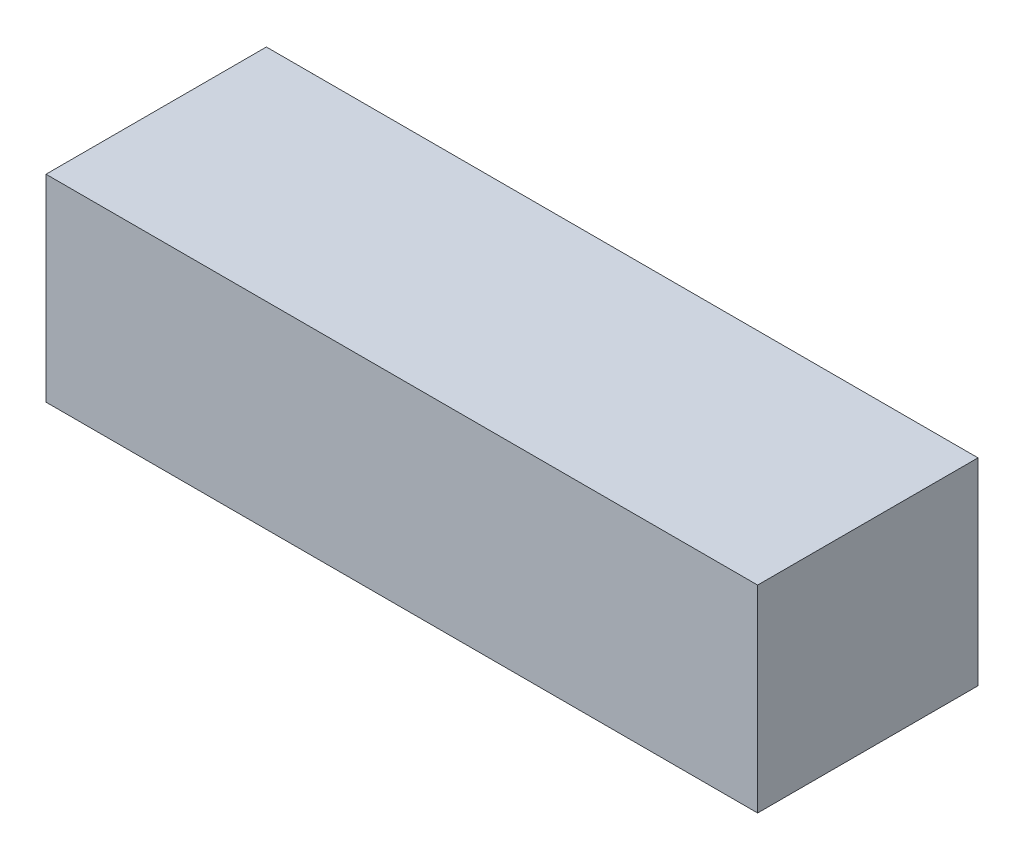
ISO-10303-21;
HEADER;
FILE_DESCRIPTION(('STEP AP214'),'2;1');
FILE_NAME('part.step','',(''),(''),'','','');
FILE_SCHEMA(('AUTOMOTIVE_DESIGN { 1 0 10303 214 1 1 1 1 }'));
ENDSEC;
DATA;
#1=APPLICATION_CONTEXT('core data for automotive mechanical design processes');
#2=APPLICATION_PROTOCOL_DEFINITION('international standard','automotive_design',2000,#1);
#3=PRODUCT_CONTEXT('',#1,'mechanical');
#4=PRODUCT('Part','Part','',(#3));
#5=PRODUCT_RELATED_PRODUCT_CATEGORY('part','',(#4));
#6=PRODUCT_DEFINITION_FORMATION('','',#4);
#7=PRODUCT_DEFINITION_CONTEXT('part definition',#1,'design');
#8=PRODUCT_DEFINITION('design','',#6,#7);
#9=PRODUCT_DEFINITION_SHAPE('','',#8);
#10=(LENGTH_UNIT() NAMED_UNIT(*) SI_UNIT(.MILLI.,.METRE.));
#11=(NAMED_UNIT(*) PLANE_ANGLE_UNIT() SI_UNIT($,.RADIAN.));
#12=(NAMED_UNIT(*) SI_UNIT($,.STERADIAN.) SOLID_ANGLE_UNIT());
#13=UNCERTAINTY_MEASURE_WITH_UNIT(LENGTH_MEASURE(1.E-05),#10,'distance_accuracy_value','');
#14=(GEOMETRIC_REPRESENTATION_CONTEXT(3) GLOBAL_UNCERTAINTY_ASSIGNED_CONTEXT((#13)) GLOBAL_UNIT_ASSIGNED_CONTEXT((#10,
#11,#12)) REPRESENTATION_CONTEXT('',''));
#15=CARTESIAN_POINT('',(0.,0.,0.));
#16=DIRECTION('',(0.,0.,1.));
#17=DIRECTION('',(1.,0.,0.));
#18=AXIS2_PLACEMENT_3D('',#15,#16,#17);
#19=CARTESIAN_POINT('',(77.5,43.,-24.));
#20=DIRECTION('',(-1.,0.,0.));
#21=DIRECTION('',(0.,0.,1.));
#22=AXIS2_PLACEMENT_3D('',#19,#20,#21);
#23=PLANE('',#22);
#24=DIRECTION('',(0.,0.,-1.));
#25=VECTOR('',#24,1.);
#26=CARTESIAN_POINT('',(77.5,0.,-24.));
#27=LINE('',#26,#25);
#28=CARTESIAN_POINT('',(77.5,0.,24.));
#29=VERTEX_POINT('',#28);
#30=CARTESIAN_POINT('',(77.5,0.,-24.));
#31=VERTEX_POINT('',#30);
#32=EDGE_CURVE('E99',#29,#31,#27,.T.);
#33=ORIENTED_EDGE('',*,*,#32,.T.);
#34=DIRECTION('',(0.,-1.,0.));
#35=VECTOR('',#34,1.);
#36=CARTESIAN_POINT('',(77.5,43.,-24.));
#37=LINE('',#36,#35);
#38=CARTESIAN_POINT('',(77.5,43.,-24.));
#39=VERTEX_POINT('',#38);
#40=EDGE_CURVE('E11',#39,#31,#37,.T.);
#41=ORIENTED_EDGE('',*,*,#40,.F.);
#42=DIRECTION('',(0.,0.,-1.));
#43=VECTOR('',#42,1.);
#44=CARTESIAN_POINT('',(77.5,43.,-24.));
#45=LINE('',#44,#43);
#46=CARTESIAN_POINT('',(77.5,43.,24.));
#47=VERTEX_POINT('',#46);
#48=EDGE_CURVE('E87',#47,#39,#45,.T.);
#49=ORIENTED_EDGE('',*,*,#48,.F.);
#50=DIRECTION('',(0.,-1.,0.));
#51=VECTOR('',#50,1.);
#52=CARTESIAN_POINT('',(77.5,43.,24.));
#53=LINE('',#52,#51);
#54=EDGE_CURVE('E95',#47,#29,#53,.T.);
#55=ORIENTED_EDGE('',*,*,#54,.T.);
#56=EDGE_LOOP('',(#33,#41,#49,#55));
#57=FACE_BOUND('',#56,.T.);
#58=ADVANCED_FACE('F36',(#57),#23,.F.);
#59=CARTESIAN_POINT('',(77.5,43.,-24.));
#60=DIRECTION('',(0.,0.,1.));
#61=DIRECTION('',(1.,0.,0.));
#62=AXIS2_PLACEMENT_3D('',#59,#60,#61);
#63=PLANE('',#62);
#64=DIRECTION('',(-1.,0.,0.));
#65=VECTOR('',#64,1.);
#66=CARTESIAN_POINT('',(77.5,0.,-24.));
#67=LINE('',#66,#65);
#68=CARTESIAN_POINT('',(-77.5,0.,-24.));
#69=VERTEX_POINT('',#68);
#70=EDGE_CURVE('E91',#31,#69,#67,.T.);
#71=ORIENTED_EDGE('',*,*,#70,.T.);
#72=DIRECTION('',(0.,-1.,0.));
#73=VECTOR('',#72,1.);
#74=CARTESIAN_POINT('',(-77.5,43.,-24.));
#75=LINE('',#74,#73);
#76=CARTESIAN_POINT('',(-77.5,43.,-24.));
#77=VERTEX_POINT('',#76);
#78=EDGE_CURVE('E44',#77,#69,#75,.T.);
#79=ORIENTED_EDGE('',*,*,#78,.F.);
#80=DIRECTION('',(-1.,0.,0.));
#81=VECTOR('',#80,1.);
#82=CARTESIAN_POINT('',(77.5,43.,-24.));
#83=LINE('',#82,#81);
#84=EDGE_CURVE('E82',#39,#77,#83,.T.);
#85=ORIENTED_EDGE('',*,*,#84,.F.);
#86=ORIENTED_EDGE('',*,*,#40,.T.);
#87=EDGE_LOOP('',(#71,#79,#85,#86));
#88=FACE_BOUND('',#87,.T.);
#89=ADVANCED_FACE('F90',(#88),#63,.F.);
#90=CARTESIAN_POINT('',(-77.5,43.,-24.));
#91=DIRECTION('',(1.,0.,0.));
#92=DIRECTION('',(0.,0.,-1.));
#93=AXIS2_PLACEMENT_3D('',#90,#91,#92);
#94=PLANE('',#93);
#95=DIRECTION('',(0.,0.,1.));
#96=VECTOR('',#95,1.);
#97=CARTESIAN_POINT('',(-77.5,0.,-24.));
#98=LINE('',#97,#96);
#99=CARTESIAN_POINT('',(-77.5,0.,24.));
#100=VERTEX_POINT('',#99);
#101=EDGE_CURVE('E69',#69,#100,#98,.T.);
#102=ORIENTED_EDGE('',*,*,#101,.T.);
#103=DIRECTION('',(0.,-1.,0.));
#104=VECTOR('',#103,1.);
#105=CARTESIAN_POINT('',(-77.5,43.,24.));
#106=LINE('',#105,#104);
#107=CARTESIAN_POINT('',(-77.5,43.,24.));
#108=VERTEX_POINT('',#107);
#109=EDGE_CURVE('E92',#108,#100,#106,.T.);
#110=ORIENTED_EDGE('',*,*,#109,.F.);
#111=DIRECTION('',(0.,0.,1.));
#112=VECTOR('',#111,1.);
#113=CARTESIAN_POINT('',(-77.5,43.,-24.));
#114=LINE('',#113,#112);
#115=EDGE_CURVE('E85',#77,#108,#114,.T.);
#116=ORIENTED_EDGE('',*,*,#115,.F.);
#117=ORIENTED_EDGE('',*,*,#78,.T.);
#118=EDGE_LOOP('',(#102,#110,#116,#117));
#119=FACE_BOUND('',#118,.T.);
#120=ADVANCED_FACE('F93',(#119),#94,.F.);
#121=CARTESIAN_POINT('',(77.5,43.,24.));
#122=DIRECTION('',(0.,0.,-1.));
#123=DIRECTION('',(-1.,0.,0.));
#124=AXIS2_PLACEMENT_3D('',#121,#122,#123);
#125=PLANE('',#124);
#126=DIRECTION('',(1.,0.,0.));
#127=VECTOR('',#126,1.);
#128=CARTESIAN_POINT('',(77.5,0.,24.));
#129=LINE('',#128,#127);
#130=EDGE_CURVE('E75',#100,#29,#129,.T.);
#131=ORIENTED_EDGE('',*,*,#130,.T.);
#132=ORIENTED_EDGE('',*,*,#54,.F.);
#133=DIRECTION('',(1.,0.,0.));
#134=VECTOR('',#133,1.);
#135=CARTESIAN_POINT('',(77.5,43.,24.));
#136=LINE('',#135,#134);
#137=EDGE_CURVE('E52',#108,#47,#136,.T.);
#138=ORIENTED_EDGE('',*,*,#137,.F.);
#139=ORIENTED_EDGE('',*,*,#109,.T.);
#140=EDGE_LOOP('',(#131,#132,#138,#139));
#141=FACE_BOUND('',#140,.T.);
#142=ADVANCED_FACE('F106',(#141),#125,.F.);
#143=CARTESIAN_POINT('',(0.,43.,0.));
#144=DIRECTION('',(0.,-1.,0.));
#145=DIRECTION('',(0.,0.,-1.));
#146=AXIS2_PLACEMENT_3D('',#143,#144,#145);
#147=PLANE('',#146);
#148=ORIENTED_EDGE('',*,*,#48,.T.);
#149=ORIENTED_EDGE('',*,*,#84,.T.);
#150=ORIENTED_EDGE('',*,*,#115,.T.);
#151=ORIENTED_EDGE('',*,*,#137,.T.);
#152=EDGE_LOOP('',(#148,#149,#150,#151));
#153=FACE_BOUND('',#152,.T.);
#154=ADVANCED_FACE('F83',(#153),#147,.F.);
#155=CARTESIAN_POINT('',(0.,0.,0.));
#156=DIRECTION('',(0.,-1.,0.));
#157=DIRECTION('',(0.,0.,-1.));
#158=AXIS2_PLACEMENT_3D('',#155,#156,#157);
#159=PLANE('',#158);
#160=ORIENTED_EDGE('',*,*,#32,.F.);
#161=ORIENTED_EDGE('',*,*,#130,.F.);
#162=ORIENTED_EDGE('',*,*,#101,.F.);
#163=ORIENTED_EDGE('',*,*,#70,.F.);
#164=EDGE_LOOP('',(#160,#161,#162,#163));
#165=FACE_BOUND('',#164,.T.);
#166=ADVANCED_FACE('F109',(#165),#159,.T.);
#167=CLOSED_SHELL('',(#58,#89,#120,#142,#154,#166));
#168=MANIFOLD_SOLID_BREP('B2',#167);
#169=ADVANCED_BREP_SHAPE_REPRESENTATION('',(#18,#168),#14);
#170=SHAPE_DEFINITION_REPRESENTATION(#9,#169);
ENDSEC;
END-ISO-10303-21;
